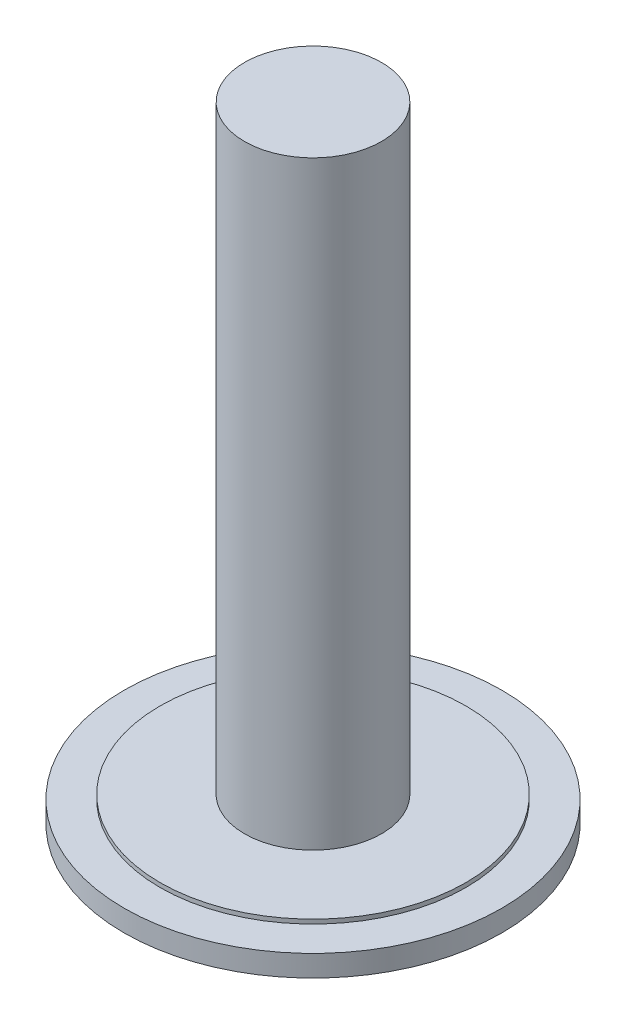
ISO-10303-21;
HEADER;
FILE_DESCRIPTION(('STEP AP214'),'2;1');
FILE_NAME('part.step','',(''),(''),'','','');
FILE_SCHEMA(('AUTOMOTIVE_DESIGN { 1 0 10303 214 1 1 1 1 }'));
ENDSEC;
DATA;
#1=APPLICATION_CONTEXT('core data for automotive mechanical design processes');
#2=APPLICATION_PROTOCOL_DEFINITION('international standard','automotive_design',2000,#1);
#3=PRODUCT_CONTEXT('',#1,'mechanical');
#4=PRODUCT('Part','Part','',(#3));
#5=PRODUCT_RELATED_PRODUCT_CATEGORY('part','',(#4));
#6=PRODUCT_DEFINITION_FORMATION('','',#4);
#7=PRODUCT_DEFINITION_CONTEXT('part definition',#1,'design');
#8=PRODUCT_DEFINITION('design','',#6,#7);
#9=PRODUCT_DEFINITION_SHAPE('','',#8);
#10=(LENGTH_UNIT() NAMED_UNIT(*) SI_UNIT(.MILLI.,.METRE.));
#11=(NAMED_UNIT(*) PLANE_ANGLE_UNIT() SI_UNIT($,.RADIAN.));
#12=(NAMED_UNIT(*) SI_UNIT($,.STERADIAN.) SOLID_ANGLE_UNIT());
#13=UNCERTAINTY_MEASURE_WITH_UNIT(LENGTH_MEASURE(1.E-05),#10,'distance_accuracy_value','');
#14=(GEOMETRIC_REPRESENTATION_CONTEXT(3) GLOBAL_UNCERTAINTY_ASSIGNED_CONTEXT((#13)) GLOBAL_UNIT_ASSIGNED_CONTEXT((#10,
#11,#12)) REPRESENTATION_CONTEXT('',''));
#15=CARTESIAN_POINT('',(0.,0.,0.));
#16=DIRECTION('',(0.,0.,1.));
#17=DIRECTION('',(1.,0.,0.));
#18=AXIS2_PLACEMENT_3D('',#15,#16,#17);
#19=CARTESIAN_POINT('',(0.,1.5,0.));
#20=DIRECTION('',(0.,-1.,0.));
#21=DIRECTION('',(0.,0.,-1.));
#22=AXIS2_PLACEMENT_3D('',#19,#20,#21);
#23=CYLINDRICAL_SURFACE('',#22,11.025);
#24=CARTESIAN_POINT('',(0.,0.,0.));
#25=DIRECTION('',(0.,1.,0.));
#26=DIRECTION('',(0.,0.,1.));
#27=AXIS2_PLACEMENT_3D('',#24,#25,#26);
#28=CIRCLE('',#27,11.025);
#29=CARTESIAN_POINT('',(0.,0.,11.025));
#30=VERTEX_POINT('',#29);
#31=EDGE_CURVE('E34',#30,#30,#28,.T.);
#32=ORIENTED_EDGE('',*,*,#31,.T.);
#33=EDGE_LOOP('',(#32));
#34=FACE_BOUND('',#33,.T.);
#35=CARTESIAN_POINT('',(0.,1.25,0.));
#36=DIRECTION('',(0.,1.,0.));
#37=DIRECTION('',(0.,0.,1.));
#38=AXIS2_PLACEMENT_3D('',#35,#36,#37);
#39=CIRCLE('',#38,11.025);
#40=CARTESIAN_POINT('',(0.,1.25,11.025));
#41=VERTEX_POINT('',#40);
#42=EDGE_CURVE('E42',#41,#41,#39,.T.);
#43=ORIENTED_EDGE('',*,*,#42,.F.);
#44=EDGE_LOOP('',(#43));
#45=FACE_BOUND('',#44,.T.);
#46=ADVANCED_FACE('F31',(#34,#45),#23,.T.);
#47=CARTESIAN_POINT('',(0.,0.,0.));
#48=DIRECTION('',(0.,1.,0.));
#49=DIRECTION('',(0.,0.,1.));
#50=AXIS2_PLACEMENT_3D('',#47,#48,#49);
#51=PLANE('',#50);
#52=ORIENTED_EDGE('',*,*,#31,.F.);
#53=EDGE_LOOP('',(#52));
#54=FACE_BOUND('',#53,.T.);
#55=ADVANCED_FACE('F57',(#54),#51,.F.);
#56=CARTESIAN_POINT('',(0.,1.25,0.));
#57=DIRECTION('',(0.,1.,0.));
#58=DIRECTION('',(0.,0.,1.));
#59=AXIS2_PLACEMENT_3D('',#56,#57,#58);
#60=PLANE('',#59);
#61=CARTESIAN_POINT('',(0.,1.25,0.));
#62=DIRECTION('',(0.,1.,0.));
#63=DIRECTION('',(0.,0.,1.));
#64=AXIS2_PLACEMENT_3D('',#61,#62,#63);
#65=CIRCLE('',#64,8.93045730357604);
#66=CARTESIAN_POINT('',(0.,1.25,8.93045730357604));
#67=VERTEX_POINT('',#66);
#68=EDGE_CURVE('E46',#67,#67,#65,.T.);
#69=ORIENTED_EDGE('',*,*,#68,.F.);
#70=EDGE_LOOP('',(#69));
#71=FACE_BOUND('',#70,.T.);
#72=ORIENTED_EDGE('',*,*,#42,.T.);
#73=EDGE_LOOP('',(#72));
#74=FACE_BOUND('',#73,.T.);
#75=ADVANCED_FACE('F54',(#71,#74),#60,.T.);
#76=CARTESIAN_POINT('',(0.,1.25,0.));
#77=DIRECTION('',(0.,1.,0.));
#78=DIRECTION('',(0.,0.,1.));
#79=AXIS2_PLACEMENT_3D('',#76,#77,#78);
#80=CYLINDRICAL_SURFACE('',#79,8.93045730357604);
#81=ORIENTED_EDGE('',*,*,#68,.T.);
#82=EDGE_LOOP('',(#81));
#83=FACE_BOUND('',#82,.T.);
#84=CARTESIAN_POINT('',(0.,1.5,0.));
#85=DIRECTION('',(0.,1.,0.));
#86=DIRECTION('',(0.,0.,1.));
#87=AXIS2_PLACEMENT_3D('',#84,#85,#86);
#88=CIRCLE('',#87,8.93045730357604);
#89=CARTESIAN_POINT('',(0.,1.5,8.93045730357604));
#90=VERTEX_POINT('',#89);
#91=EDGE_CURVE('E49',#90,#90,#88,.T.);
#92=ORIENTED_EDGE('',*,*,#91,.F.);
#93=EDGE_LOOP('',(#92));
#94=FACE_BOUND('',#93,.T.);
#95=ADVANCED_FACE('F67',(#83,#94),#80,.T.);
#96=CARTESIAN_POINT('',(0.,1.5,0.));
#97=DIRECTION('',(0.,1.,0.));
#98=DIRECTION('',(0.,0.,1.));
#99=AXIS2_PLACEMENT_3D('',#96,#97,#98);
#100=PLANE('',#99);
#101=CARTESIAN_POINT('',(0.,1.5,0.));
#102=DIRECTION('',(0.,1.,0.));
#103=DIRECTION('',(0.,0.,1.));
#104=AXIS2_PLACEMENT_3D('',#101,#102,#103);
#105=CIRCLE('',#104,4.);
#106=CARTESIAN_POINT('',(0.,1.5,4.));
#107=VERTEX_POINT('',#106);
#108=EDGE_CURVE('E10',#107,#107,#105,.T.);
#109=ORIENTED_EDGE('',*,*,#108,.F.);
#110=EDGE_LOOP('',(#109));
#111=FACE_BOUND('',#110,.T.);
#112=ORIENTED_EDGE('',*,*,#91,.T.);
#113=EDGE_LOOP('',(#112));
#114=FACE_BOUND('',#113,.T.);
#115=ADVANCED_FACE('F71',(#111,#114),#100,.T.);
#116=CARTESIAN_POINT('',(0.,36.5,0.));
#117=DIRECTION('',(0.,-1.,0.));
#118=DIRECTION('',(0.,0.,-1.));
#119=AXIS2_PLACEMENT_3D('',#116,#117,#118);
#120=CYLINDRICAL_SURFACE('',#119,4.);
#121=CARTESIAN_POINT('',(0.,36.5,0.));
#122=DIRECTION('',(0.,1.,0.));
#123=DIRECTION('',(0.,0.,1.));
#124=AXIS2_PLACEMENT_3D('',#121,#122,#123);
#125=CIRCLE('',#124,4.);
#126=CARTESIAN_POINT('',(0.,36.5,4.));
#127=VERTEX_POINT('',#126);
#128=EDGE_CURVE('E45',#127,#127,#125,.T.);
#129=ORIENTED_EDGE('',*,*,#128,.F.);
#130=EDGE_LOOP('',(#129));
#131=FACE_BOUND('',#130,.T.);
#132=ORIENTED_EDGE('',*,*,#108,.T.);
#133=EDGE_LOOP('',(#132));
#134=FACE_BOUND('',#133,.T.);
#135=ADVANCED_FACE('F73',(#131,#134),#120,.T.);
#136=CARTESIAN_POINT('',(0.,36.5,0.));
#137=DIRECTION('',(0.,1.,0.));
#138=DIRECTION('',(0.,0.,1.));
#139=AXIS2_PLACEMENT_3D('',#136,#137,#138);
#140=PLANE('',#139);
#141=ORIENTED_EDGE('',*,*,#128,.T.);
#142=EDGE_LOOP('',(#141));
#143=FACE_BOUND('',#142,.T.);
#144=ADVANCED_FACE('F81',(#143),#140,.T.);
#145=CLOSED_SHELL('',(#46,#55,#75,#95,#115,#135,#144));
#146=MANIFOLD_SOLID_BREP('B2',#145);
#147=ADVANCED_BREP_SHAPE_REPRESENTATION('',(#18,#146),#14);
#148=SHAPE_DEFINITION_REPRESENTATION(#9,#147);
ENDSEC;
END-ISO-10303-21;
